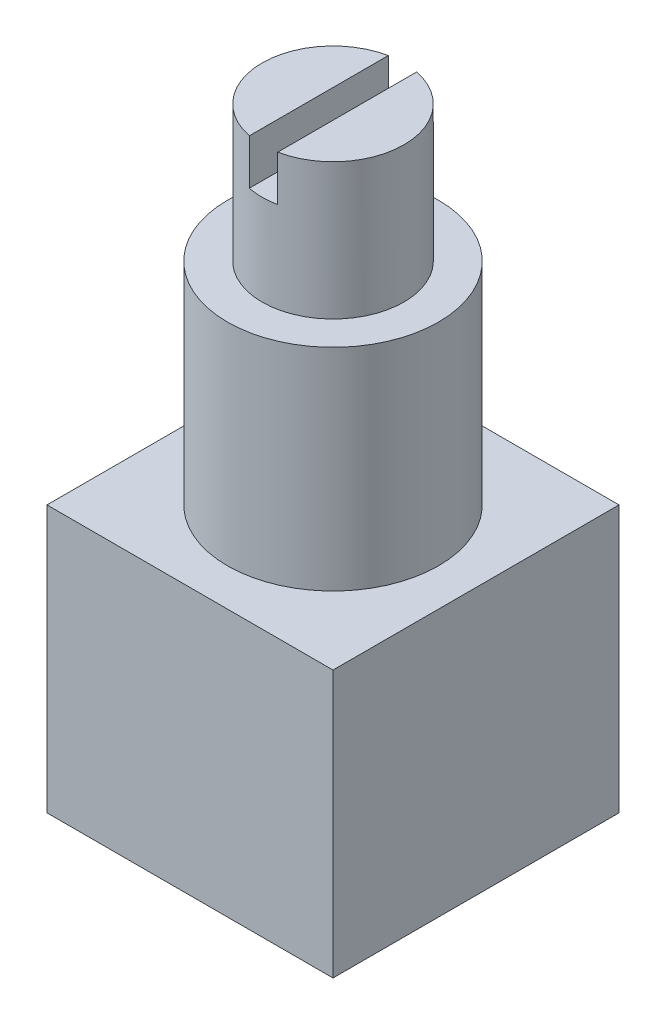
ISO-10303-21;
HEADER;
FILE_DESCRIPTION(('STEP AP214'),'2;1');
FILE_NAME('part.step','',(''),(''),'','','');
FILE_SCHEMA(('AUTOMOTIVE_DESIGN { 1 0 10303 214 1 1 1 1 }'));
ENDSEC;
DATA;
#1=APPLICATION_CONTEXT('core data for automotive mechanical design processes');
#2=APPLICATION_PROTOCOL_DEFINITION('international standard','automotive_design',2000,#1);
#3=PRODUCT_CONTEXT('',#1,'mechanical');
#4=PRODUCT('Part','Part','',(#3));
#5=PRODUCT_RELATED_PRODUCT_CATEGORY('part','',(#4));
#6=PRODUCT_DEFINITION_FORMATION('','',#4);
#7=PRODUCT_DEFINITION_CONTEXT('part definition',#1,'design');
#8=PRODUCT_DEFINITION('design','',#6,#7);
#9=PRODUCT_DEFINITION_SHAPE('','',#8);
#10=(LENGTH_UNIT() NAMED_UNIT(*) SI_UNIT(.MILLI.,.METRE.));
#11=(NAMED_UNIT(*) PLANE_ANGLE_UNIT() SI_UNIT($,.RADIAN.));
#12=(NAMED_UNIT(*) SI_UNIT($,.STERADIAN.) SOLID_ANGLE_UNIT());
#13=UNCERTAINTY_MEASURE_WITH_UNIT(LENGTH_MEASURE(1.E-05),#10,'distance_accuracy_value','');
#14=(GEOMETRIC_REPRESENTATION_CONTEXT(3) GLOBAL_UNCERTAINTY_ASSIGNED_CONTEXT((#13)) GLOBAL_UNIT_ASSIGNED_CONTEXT((#10,
#11,#12)) REPRESENTATION_CONTEXT('',''));
#15=CARTESIAN_POINT('',(0.,0.,0.));
#16=DIRECTION('',(0.,0.,1.));
#17=DIRECTION('',(1.,0.,0.));
#18=AXIS2_PLACEMENT_3D('',#15,#16,#17);
#19=CARTESIAN_POINT('',(0.,27.05,0.));
#20=DIRECTION('',(0.,1.,0.));
#21=DIRECTION('',(0.,0.,1.));
#22=AXIS2_PLACEMENT_3D('',#19,#20,#21);
#23=PLANE('',#22);
#24=DIRECTION('',(0.,0.,1.));
#25=VECTOR('',#24,1.);
#26=CARTESIAN_POINT('',(-0.625,27.05,0.));
#27=LINE('',#26,#25);
#28=CARTESIAN_POINT('',(-0.625,27.05,-3.06186217847897));
#29=VERTEX_POINT('',#28);
#30=CARTESIAN_POINT('',(-0.625,27.05,3.06186217847897));
#31=VERTEX_POINT('',#30);
#32=EDGE_CURVE('E127',#29,#31,#27,.T.);
#33=ORIENTED_EDGE('',*,*,#32,.F.);
#34=CARTESIAN_POINT('',(0.,27.05,0.));
#35=DIRECTION('',(0.,1.,0.));
#36=DIRECTION('',(0.,0.,1.));
#37=AXIS2_PLACEMENT_3D('',#34,#35,#36);
#38=CIRCLE('',#37,3.125);
#39=EDGE_CURVE('E140',#29,#31,#38,.T.);
#40=ORIENTED_EDGE('',*,*,#39,.T.);
#41=EDGE_LOOP('',(#33,#40));
#42=FACE_BOUND('',#41,.T.);
#43=ADVANCED_FACE('F46',(#42),#23,.T.);
#44=CARTESIAN_POINT('',(6.3,11.75,-6.3));
#45=DIRECTION('',(-1.,0.,0.));
#46=DIRECTION('',(0.,0.,1.));
#47=AXIS2_PLACEMENT_3D('',#44,#45,#46);
#48=PLANE('',#47);
#49=DIRECTION('',(0.,0.,-1.));
#50=VECTOR('',#49,1.);
#51=CARTESIAN_POINT('',(6.3,0.,-6.3));
#52=LINE('',#51,#50);
#53=CARTESIAN_POINT('',(6.3,0.,6.3));
#54=VERTEX_POINT('',#53);
#55=CARTESIAN_POINT('',(6.3,0.,-6.3));
#56=VERTEX_POINT('',#55);
#57=EDGE_CURVE('E143',#54,#56,#52,.T.);
#58=ORIENTED_EDGE('',*,*,#57,.T.);
#59=DIRECTION('',(0.,-1.,0.));
#60=VECTOR('',#59,1.);
#61=CARTESIAN_POINT('',(6.3,11.75,-6.3));
#62=LINE('',#61,#60);
#63=CARTESIAN_POINT('',(6.3,11.75,-6.3));
#64=VERTEX_POINT('',#63);
#65=EDGE_CURVE('E155',#64,#56,#62,.T.);
#66=ORIENTED_EDGE('',*,*,#65,.F.);
#67=DIRECTION('',(0.,0.,-1.));
#68=VECTOR('',#67,1.);
#69=CARTESIAN_POINT('',(6.3,11.75,-6.3));
#70=LINE('',#69,#68);
#71=CARTESIAN_POINT('',(6.3,11.75,6.3));
#72=VERTEX_POINT('',#71);
#73=EDGE_CURVE('E156',#72,#64,#70,.T.);
#74=ORIENTED_EDGE('',*,*,#73,.F.);
#75=DIRECTION('',(0.,-1.,0.));
#76=VECTOR('',#75,1.);
#77=CARTESIAN_POINT('',(6.3,11.75,6.3));
#78=LINE('',#77,#76);
#79=EDGE_CURVE('E162',#72,#54,#78,.T.);
#80=ORIENTED_EDGE('',*,*,#79,.T.);
#81=EDGE_LOOP('',(#58,#66,#74,#80));
#82=FACE_BOUND('',#81,.T.);
#83=ADVANCED_FACE('F48',(#82),#48,.F.);
#84=CARTESIAN_POINT('',(-6.3,11.75,-6.3));
#85=DIRECTION('',(0.,0.,1.));
#86=DIRECTION('',(1.,0.,0.));
#87=AXIS2_PLACEMENT_3D('',#84,#85,#86);
#88=PLANE('',#87);
#89=DIRECTION('',(-1.,0.,0.));
#90=VECTOR('',#89,1.);
#91=CARTESIAN_POINT('',(-6.3,0.,-6.3));
#92=LINE('',#91,#90);
#93=CARTESIAN_POINT('',(-6.3,0.,-6.3));
#94=VERTEX_POINT('',#93);
#95=EDGE_CURVE('E165',#56,#94,#92,.T.);
#96=ORIENTED_EDGE('',*,*,#95,.T.);
#97=DIRECTION('',(0.,-1.,0.));
#98=VECTOR('',#97,1.);
#99=CARTESIAN_POINT('',(-6.3,11.75,-6.3));
#100=LINE('',#99,#98);
#101=CARTESIAN_POINT('',(-6.3,11.75,-6.3));
#102=VERTEX_POINT('',#101);
#103=EDGE_CURVE('E173',#102,#94,#100,.T.);
#104=ORIENTED_EDGE('',*,*,#103,.F.);
#105=DIRECTION('',(-1.,0.,0.));
#106=VECTOR('',#105,1.);
#107=CARTESIAN_POINT('',(-6.3,11.75,-6.3));
#108=LINE('',#107,#106);
#109=EDGE_CURVE('E99',#64,#102,#108,.T.);
#110=ORIENTED_EDGE('',*,*,#109,.F.);
#111=ORIENTED_EDGE('',*,*,#65,.T.);
#112=EDGE_LOOP('',(#96,#104,#110,#111));
#113=FACE_BOUND('',#112,.T.);
#114=ADVANCED_FACE('F190',(#113),#88,.F.);
#115=CARTESIAN_POINT('',(-6.3,11.75,-6.3));
#116=DIRECTION('',(1.,0.,0.));
#117=DIRECTION('',(0.,0.,-1.));
#118=AXIS2_PLACEMENT_3D('',#115,#116,#117);
#119=PLANE('',#118);
#120=DIRECTION('',(0.,0.,1.));
#121=VECTOR('',#120,1.);
#122=CARTESIAN_POINT('',(-6.3,0.,-6.3));
#123=LINE('',#122,#121);
#124=CARTESIAN_POINT('',(-6.3,0.,6.3));
#125=VERTEX_POINT('',#124);
#126=EDGE_CURVE('E167',#94,#125,#123,.T.);
#127=ORIENTED_EDGE('',*,*,#126,.T.);
#128=DIRECTION('',(0.,-1.,0.));
#129=VECTOR('',#128,1.);
#130=CARTESIAN_POINT('',(-6.3,11.75,6.3));
#131=LINE('',#130,#129);
#132=CARTESIAN_POINT('',(-6.3,11.75,6.3));
#133=VERTEX_POINT('',#132);
#134=EDGE_CURVE('E171',#133,#125,#131,.T.);
#135=ORIENTED_EDGE('',*,*,#134,.F.);
#136=DIRECTION('',(0.,0.,1.));
#137=VECTOR('',#136,1.);
#138=CARTESIAN_POINT('',(-6.3,11.75,-6.3));
#139=LINE('',#138,#137);
#140=EDGE_CURVE('E159',#102,#133,#139,.T.);
#141=ORIENTED_EDGE('',*,*,#140,.F.);
#142=ORIENTED_EDGE('',*,*,#103,.T.);
#143=EDGE_LOOP('',(#127,#135,#141,#142));
#144=FACE_BOUND('',#143,.T.);
#145=ADVANCED_FACE('F224',(#144),#119,.F.);
#146=CARTESIAN_POINT('',(-6.3,11.75,6.3));
#147=DIRECTION('',(0.,0.,-1.));
#148=DIRECTION('',(-1.,0.,0.));
#149=AXIS2_PLACEMENT_3D('',#146,#147,#148);
#150=PLANE('',#149);
#151=DIRECTION('',(1.,0.,0.));
#152=VECTOR('',#151,1.);
#153=CARTESIAN_POINT('',(-6.3,0.,6.3));
#154=LINE('',#153,#152);
#155=EDGE_CURVE('E91',#125,#54,#154,.T.);
#156=ORIENTED_EDGE('',*,*,#155,.T.);
#157=ORIENTED_EDGE('',*,*,#79,.F.);
#158=DIRECTION('',(1.,0.,0.));
#159=VECTOR('',#158,1.);
#160=CARTESIAN_POINT('',(-6.3,11.75,6.3));
#161=LINE('',#160,#159);
#162=EDGE_CURVE('E70',#133,#72,#161,.T.);
#163=ORIENTED_EDGE('',*,*,#162,.F.);
#164=ORIENTED_EDGE('',*,*,#134,.T.);
#165=EDGE_LOOP('',(#156,#157,#163,#164));
#166=FACE_BOUND('',#165,.T.);
#167=ADVANCED_FACE('F217',(#166),#150,.F.);
#168=CARTESIAN_POINT('',(0.,11.75,0.));
#169=DIRECTION('',(0.,1.,0.));
#170=DIRECTION('',(0.,0.,1.));
#171=AXIS2_PLACEMENT_3D('',#168,#169,#170);
#172=PLANE('',#171);
#173=CARTESIAN_POINT('',(0.,11.75,0.));
#174=DIRECTION('',(0.,1.,0.));
#175=DIRECTION('',(0.,0.,1.));
#176=AXIS2_PLACEMENT_3D('',#173,#174,#175);
#177=CIRCLE('',#176,4.65);
#178=CARTESIAN_POINT('',(0.,11.75,4.65));
#179=VERTEX_POINT('',#178);
#180=EDGE_CURVE('E151',#179,#179,#177,.T.);
#181=ORIENTED_EDGE('',*,*,#180,.F.);
#182=EDGE_LOOP('',(#181));
#183=FACE_BOUND('',#182,.T.);
#184=ORIENTED_EDGE('',*,*,#73,.T.);
#185=ORIENTED_EDGE('',*,*,#109,.T.);
#186=ORIENTED_EDGE('',*,*,#140,.T.);
#187=ORIENTED_EDGE('',*,*,#162,.T.);
#188=EDGE_LOOP('',(#184,#185,#186,#187));
#189=FACE_BOUND('',#188,.T.);
#190=ADVANCED_FACE('F214',(#183,#189),#172,.T.);
#191=CARTESIAN_POINT('',(0.,0.,0.));
#192=DIRECTION('',(0.,1.,0.));
#193=DIRECTION('',(0.,0.,1.));
#194=AXIS2_PLACEMENT_3D('',#191,#192,#193);
#195=PLANE('',#194);
#196=ORIENTED_EDGE('',*,*,#57,.F.);
#197=ORIENTED_EDGE('',*,*,#155,.F.);
#198=ORIENTED_EDGE('',*,*,#126,.F.);
#199=ORIENTED_EDGE('',*,*,#95,.F.);
#200=EDGE_LOOP('',(#196,#197,#198,#199));
#201=FACE_BOUND('',#200,.T.);
#202=ADVANCED_FACE('F212',(#201),#195,.F.);
#203=CARTESIAN_POINT('',(0.,21.05,0.));
#204=DIRECTION('',(0.,-1.,0.));
#205=DIRECTION('',(0.,0.,-1.));
#206=AXIS2_PLACEMENT_3D('',#203,#204,#205);
#207=CYLINDRICAL_SURFACE('',#206,4.65);
#208=CARTESIAN_POINT('',(0.,21.05,0.));
#209=DIRECTION('',(0.,1.,0.));
#210=DIRECTION('',(0.,0.,1.));
#211=AXIS2_PLACEMENT_3D('',#208,#209,#210);
#212=CIRCLE('',#211,4.65);
#213=CARTESIAN_POINT('',(0.,21.05,4.65));
#214=VERTEX_POINT('',#213);
#215=EDGE_CURVE('E139',#214,#214,#212,.T.);
#216=ORIENTED_EDGE('',*,*,#215,.F.);
#217=EDGE_LOOP('',(#216));
#218=FACE_BOUND('',#217,.T.);
#219=ORIENTED_EDGE('',*,*,#180,.T.);
#220=EDGE_LOOP('',(#219));
#221=FACE_BOUND('',#220,.T.);
#222=ADVANCED_FACE('F206',(#218,#221),#207,.T.);
#223=CARTESIAN_POINT('',(0.,21.05,0.));
#224=DIRECTION('',(0.,1.,0.));
#225=DIRECTION('',(0.,0.,1.));
#226=AXIS2_PLACEMENT_3D('',#223,#224,#225);
#227=PLANE('',#226);
#228=CARTESIAN_POINT('',(0.,21.05,0.));
#229=DIRECTION('',(0.,1.,0.));
#230=DIRECTION('',(0.,0.,1.));
#231=AXIS2_PLACEMENT_3D('',#228,#229,#230);
#232=CIRCLE('',#231,3.125);
#233=CARTESIAN_POINT('',(0.,21.05,3.125));
#234=VERTEX_POINT('',#233);
#235=EDGE_CURVE('E128',#234,#234,#232,.T.);
#236=ORIENTED_EDGE('',*,*,#235,.F.);
#237=EDGE_LOOP('',(#236));
#238=FACE_BOUND('',#237,.T.);
#239=ORIENTED_EDGE('',*,*,#215,.T.);
#240=EDGE_LOOP('',(#239));
#241=FACE_BOUND('',#240,.T.);
#242=ADVANCED_FACE('F202',(#238,#241),#227,.T.);
#243=CARTESIAN_POINT('',(0.,27.05,0.));
#244=DIRECTION('',(0.,-1.,0.));
#245=DIRECTION('',(0.,0.,-1.));
#246=AXIS2_PLACEMENT_3D('',#243,#244,#245);
#247=CYLINDRICAL_SURFACE('',#246,3.125);
#248=CARTESIAN_POINT('',(0.,25.05,0.));
#249=DIRECTION('',(0.,-1.,0.));
#250=DIRECTION('',(1.,0.,0.));
#251=AXIS2_PLACEMENT_3D('',#248,#249,#250);
#252=CIRCLE('',#251,3.125);
#253=CARTESIAN_POINT('',(0.625,25.05,3.06186217847897));
#254=VERTEX_POINT('',#253);
#255=CARTESIAN_POINT('',(-0.625,25.05,3.06186217847897));
#256=VERTEX_POINT('',#255);
#257=EDGE_CURVE('E13',#254,#256,#252,.T.);
#258=ORIENTED_EDGE('',*,*,#257,.T.);
#259=DIRECTION('',(0.,-1.,0.));
#260=VECTOR('',#259,1.);
#261=CARTESIAN_POINT('',(-0.625,27.05,3.06186217847897));
#262=LINE('',#261,#260);
#263=EDGE_CURVE('E181',#256,#31,#262,.F.);
#264=ORIENTED_EDGE('',*,*,#263,.T.);
#265=ORIENTED_EDGE('',*,*,#39,.F.);
#266=DIRECTION('',(0.,-1.,0.));
#267=VECTOR('',#266,1.);
#268=CARTESIAN_POINT('',(-0.625,27.05,-3.06186217847897));
#269=LINE('',#268,#267);
#270=CARTESIAN_POINT('',(-0.625,25.05,-3.06186217847897));
#271=VERTEX_POINT('',#270);
#272=EDGE_CURVE('E146',#29,#271,#269,.T.);
#273=ORIENTED_EDGE('',*,*,#272,.T.);
#274=CARTESIAN_POINT('',(0.625,25.05,-3.06186217847897));
#275=VERTEX_POINT('',#274);
#276=EDGE_CURVE('E50',#271,#275,#252,.T.);
#277=ORIENTED_EDGE('',*,*,#276,.T.);
#278=DIRECTION('',(0.,-1.,0.));
#279=VECTOR('',#278,1.);
#280=CARTESIAN_POINT('',(0.625,27.05,-3.06186217847897));
#281=LINE('',#280,#279);
#282=CARTESIAN_POINT('',(0.625,27.05,-3.06186217847897));
#283=VERTEX_POINT('',#282);
#284=EDGE_CURVE('E122',#275,#283,#281,.F.);
#285=ORIENTED_EDGE('',*,*,#284,.T.);
#286=CARTESIAN_POINT('',(0.625,27.05,3.06186217847897));
#287=VERTEX_POINT('',#286);
#288=EDGE_CURVE('E134',#287,#283,#38,.T.);
#289=ORIENTED_EDGE('',*,*,#288,.F.);
#290=DIRECTION('',(0.,-1.,0.));
#291=VECTOR('',#290,1.);
#292=CARTESIAN_POINT('',(0.625,27.05,3.06186217847897));
#293=LINE('',#292,#291);
#294=EDGE_CURVE('E61',#287,#254,#293,.T.);
#295=ORIENTED_EDGE('',*,*,#294,.T.);
#296=EDGE_LOOP('',(#258,#264,#265,#273,#277,#285,#289,#295));
#297=FACE_BOUND('',#296,.T.);
#298=ORIENTED_EDGE('',*,*,#235,.T.);
#299=EDGE_LOOP('',(#298));
#300=FACE_BOUND('',#299,.T.);
#301=ADVANCED_FACE('F132',(#297,#300),#247,.T.);
#302=DIRECTION('',(0.,0.,-1.));
#303=VECTOR('',#302,1.);
#304=CARTESIAN_POINT('',(0.625,27.05,0.));
#305=LINE('',#304,#303);
#306=EDGE_CURVE('E119',#287,#283,#305,.T.);
#307=ORIENTED_EDGE('',*,*,#306,.F.);
#308=ORIENTED_EDGE('',*,*,#288,.T.);
#309=EDGE_LOOP('',(#307,#308));
#310=FACE_BOUND('',#309,.T.);
#311=ADVANCED_FACE('F138',(#310),#23,.T.);
#312=CARTESIAN_POINT('',(0.625,25.05,-6.3));
#313=DIRECTION('',(0.,-1.,0.));
#314=DIRECTION('',(1.,0.,0.));
#315=AXIS2_PLACEMENT_3D('',#312,#313,#314);
#316=PLANE('',#315);
#317=DIRECTION('',(0.,0.,1.));
#318=VECTOR('',#317,1.);
#319=CARTESIAN_POINT('',(0.625,25.05,-6.3));
#320=LINE('',#319,#318);
#321=EDGE_CURVE('E136',#275,#254,#320,.T.);
#322=ORIENTED_EDGE('',*,*,#321,.F.);
#323=ORIENTED_EDGE('',*,*,#276,.F.);
#324=DIRECTION('',(0.,0.,1.));
#325=VECTOR('',#324,1.);
#326=CARTESIAN_POINT('',(-0.625,25.05,-6.3));
#327=LINE('',#326,#325);
#328=EDGE_CURVE('E320',#271,#256,#327,.T.);
#329=ORIENTED_EDGE('',*,*,#328,.T.);
#330=ORIENTED_EDGE('',*,*,#257,.F.);
#331=EDGE_LOOP('',(#322,#323,#329,#330));
#332=FACE_BOUND('',#331,.T.);
#333=ADVANCED_FACE('F195',(#332),#316,.F.);
#334=CARTESIAN_POINT('',(-0.625,25.05,-6.3));
#335=DIRECTION('',(-1.,0.,0.));
#336=DIRECTION('',(0.,0.,1.));
#337=AXIS2_PLACEMENT_3D('',#334,#335,#336);
#338=PLANE('',#337);
#339=ORIENTED_EDGE('',*,*,#32,.T.);
#340=ORIENTED_EDGE('',*,*,#263,.F.);
#341=ORIENTED_EDGE('',*,*,#328,.F.);
#342=ORIENTED_EDGE('',*,*,#272,.F.);
#343=EDGE_LOOP('',(#339,#340,#341,#342));
#344=FACE_BOUND('',#343,.T.);
#345=ADVANCED_FACE('F179',(#344),#338,.F.);
#346=CARTESIAN_POINT('',(0.625,25.05,-6.3));
#347=DIRECTION('',(1.,0.,0.));
#348=DIRECTION('',(0.,0.,-1.));
#349=AXIS2_PLACEMENT_3D('',#346,#347,#348);
#350=PLANE('',#349);
#351=ORIENTED_EDGE('',*,*,#306,.T.);
#352=ORIENTED_EDGE('',*,*,#284,.F.);
#353=ORIENTED_EDGE('',*,*,#321,.T.);
#354=ORIENTED_EDGE('',*,*,#294,.F.);
#355=EDGE_LOOP('',(#351,#352,#353,#354));
#356=FACE_BOUND('',#355,.T.);
#357=ADVANCED_FACE('F121',(#356),#350,.F.);
#358=CLOSED_SHELL('',(#43,#83,#114,#145,#167,#190,#202,#222,#242,#301,#311,#333,#345,#357));
#359=MANIFOLD_SOLID_BREP('B2',#358);
#360=ADVANCED_BREP_SHAPE_REPRESENTATION('',(#18,#359),#14);
#361=SHAPE_DEFINITION_REPRESENTATION(#9,#360);
ENDSEC;
END-ISO-10303-21;
